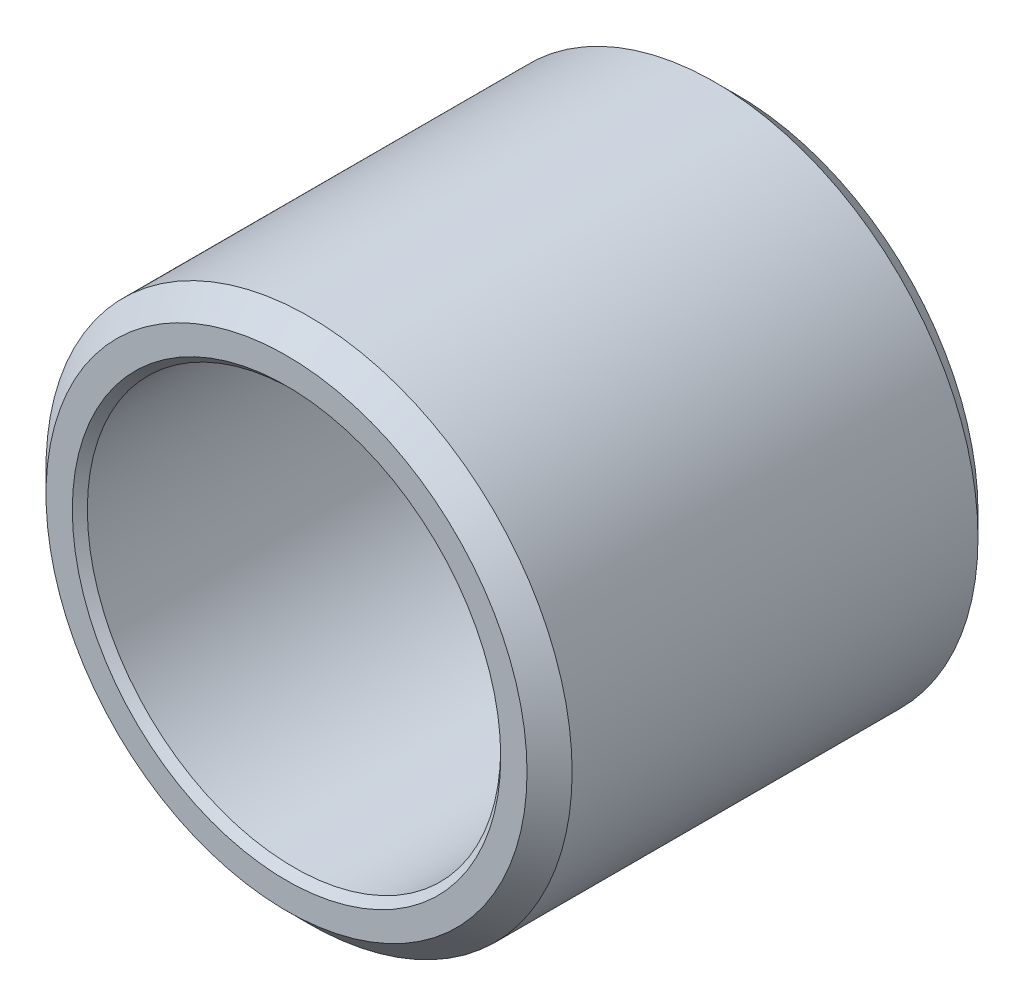
ISO-10303-21;
HEADER;
FILE_DESCRIPTION(('STEP AP214'),'2;1');
FILE_NAME('part.step','',(''),(''),'','','');
FILE_SCHEMA(('AUTOMOTIVE_DESIGN { 1 0 10303 214 1 1 1 1 }'));
ENDSEC;
DATA;
#1=APPLICATION_CONTEXT('core data for automotive mechanical design processes');
#2=APPLICATION_PROTOCOL_DEFINITION('international standard','automotive_design',2000,#1);
#3=PRODUCT_CONTEXT('',#1,'mechanical');
#4=PRODUCT('Part','Part','',(#3));
#5=PRODUCT_RELATED_PRODUCT_CATEGORY('part','',(#4));
#6=PRODUCT_DEFINITION_FORMATION('','',#4);
#7=PRODUCT_DEFINITION_CONTEXT('part definition',#1,'design');
#8=PRODUCT_DEFINITION('design','',#6,#7);
#9=PRODUCT_DEFINITION_SHAPE('','',#8);
#10=(LENGTH_UNIT() NAMED_UNIT(*) SI_UNIT(.MILLI.,.METRE.));
#11=(NAMED_UNIT(*) PLANE_ANGLE_UNIT() SI_UNIT($,.RADIAN.));
#12=(NAMED_UNIT(*) SI_UNIT($,.STERADIAN.) SOLID_ANGLE_UNIT());
#13=UNCERTAINTY_MEASURE_WITH_UNIT(LENGTH_MEASURE(1.E-05),#10,'distance_accuracy_value','');
#14=(GEOMETRIC_REPRESENTATION_CONTEXT(3) GLOBAL_UNCERTAINTY_ASSIGNED_CONTEXT((#13)) GLOBAL_UNIT_ASSIGNED_CONTEXT((#10,
#11,#12)) REPRESENTATION_CONTEXT('',''));
#15=CARTESIAN_POINT('',(0.,0.,0.));
#16=DIRECTION('',(0.,0.,1.));
#17=DIRECTION('',(1.,0.,0.));
#18=AXIS2_PLACEMENT_3D('',#15,#16,#17);
#19=CARTESIAN_POINT('',(0.,0.,60.));
#20=DIRECTION('',(0.,0.,-1.));
#21=DIRECTION('',(-1.,0.,0.));
#22=AXIS2_PLACEMENT_3D('',#19,#20,#21);
#23=CYLINDRICAL_SURFACE('',#22,27.5);
#24=CARTESIAN_POINT('',(0.,0.,59.));
#25=DIRECTION('',(0.,0.,1.));
#26=DIRECTION('',(1.,0.,0.));
#27=AXIS2_PLACEMENT_3D('',#24,#25,#26);
#28=CIRCLE('',#27,27.5);
#29=CARTESIAN_POINT('',(27.5,0.,59.));
#30=VERTEX_POINT('',#29);
#31=EDGE_CURVE('E39',#30,#30,#28,.T.);
#32=ORIENTED_EDGE('',*,*,#31,.T.);
#33=EDGE_LOOP('',(#32));
#34=FACE_BOUND('',#33,.T.);
#35=CARTESIAN_POINT('',(-8.88178419700125E-13,-4.9960036108132E-13,6.70000000000004));
#36=DIRECTION('',(0.,0.,-1.));
#37=DIRECTION('',(-1.,0.,0.));
#38=AXIS2_PLACEMENT_3D('',#35,#36,#37);
#39=CIRCLE('',#38,27.5);
#40=CARTESIAN_POINT('',(-27.5000000000009,-5.400541125411E-13,6.70000000000003));
#41=VERTEX_POINT('',#40);
#42=EDGE_CURVE('E53',#41,#41,#39,.T.);
#43=ORIENTED_EDGE('',*,*,#42,.T.);
#44=EDGE_LOOP('',(#43));
#45=FACE_BOUND('',#44,.T.);
#46=ADVANCED_FACE('F32',(#34,#45),#23,.F.);
#47=CARTESIAN_POINT('',(0.,0.,1.));
#48=DIRECTION('',(0.,0.,1.));
#49=DIRECTION('',(1.,0.,0.));
#50=AXIS2_PLACEMENT_3D('',#47,#48,#49);
#51=CIRCLE('',#50,27.5);
#52=CARTESIAN_POINT('',(27.5,0.,1.00000000000002));
#53=VERTEX_POINT('',#52);
#54=EDGE_CURVE('E43',#53,#53,#51,.F.);
#55=ORIENTED_EDGE('',*,*,#54,.T.);
#56=EDGE_LOOP('',(#55));
#57=FACE_BOUND('',#56,.T.);
#58=CARTESIAN_POINT('',(-8.88178419700125E-13,-4.9960036108132E-13,4.49999999999995));
#59=DIRECTION('',(0.,0.,1.));
#60=DIRECTION('',(1.,0.,0.));
#61=AXIS2_PLACEMENT_3D('',#58,#59,#60);
#62=CIRCLE('',#61,27.5);
#63=CARTESIAN_POINT('',(27.4999999999991,-4.59146609621541E-13,4.49999999999996));
#64=VERTEX_POINT('',#63);
#65=EDGE_CURVE('E57',#64,#64,#62,.T.);
#66=ORIENTED_EDGE('',*,*,#65,.T.);
#67=EDGE_LOOP('',(#66));
#68=FACE_BOUND('',#67,.T.);
#69=ADVANCED_FACE('F94',(#57,#68),#23,.F.);
#70=CARTESIAN_POINT('',(0.,0.,60.));
#71=DIRECTION('',(0.,0.,1.));
#72=DIRECTION('',(1.,0.,0.));
#73=AXIS2_PLACEMENT_3D('',#70,#71,#72);
#74=PLANE('',#73);
#75=CARTESIAN_POINT('',(0.,0.,60.));
#76=DIRECTION('',(0.,0.,1.));
#77=DIRECTION('',(1.,0.,0.));
#78=AXIS2_PLACEMENT_3D('',#75,#76,#77);
#79=CIRCLE('',#78,28.5);
#80=CARTESIAN_POINT('',(28.5,0.,60.));
#81=VERTEX_POINT('',#80);
#82=EDGE_CURVE('E10',#81,#81,#79,.F.);
#83=ORIENTED_EDGE('',*,*,#82,.T.);
#84=EDGE_LOOP('',(#83));
#85=FACE_BOUND('',#84,.T.);
#86=CARTESIAN_POINT('',(0.,0.,60.));
#87=DIRECTION('',(0.,0.,1.));
#88=DIRECTION('',(1.,0.,0.));
#89=AXIS2_PLACEMENT_3D('',#86,#87,#88);
#90=CIRCLE('',#89,32.);
#91=CARTESIAN_POINT('',(32.,0.,60.));
#92=VERTEX_POINT('',#91);
#93=EDGE_CURVE('E52',#92,#92,#90,.T.);
#94=ORIENTED_EDGE('',*,*,#93,.T.);
#95=EDGE_LOOP('',(#94));
#96=FACE_BOUND('',#95,.T.);
#97=ADVANCED_FACE('F99',(#85,#96),#74,.T.);
#98=CARTESIAN_POINT('',(0.,0.,0.));
#99=DIRECTION('',(0.,0.,1.));
#100=DIRECTION('',(1.,0.,0.));
#101=AXIS2_PLACEMENT_3D('',#98,#99,#100);
#102=PLANE('',#101);
#103=CARTESIAN_POINT('',(0.,0.,0.));
#104=DIRECTION('',(0.,0.,1.));
#105=DIRECTION('',(1.,0.,0.));
#106=AXIS2_PLACEMENT_3D('',#103,#104,#105);
#107=CIRCLE('',#106,28.5);
#108=CARTESIAN_POINT('',(28.5,0.,0.));
#109=VERTEX_POINT('',#108);
#110=EDGE_CURVE('E47',#109,#109,#107,.T.);
#111=ORIENTED_EDGE('',*,*,#110,.T.);
#112=EDGE_LOOP('',(#111));
#113=FACE_BOUND('',#112,.T.);
#114=CARTESIAN_POINT('',(0.,0.,0.));
#115=DIRECTION('',(0.,0.,1.));
#116=DIRECTION('',(1.,0.,0.));
#117=AXIS2_PLACEMENT_3D('',#114,#115,#116);
#118=CIRCLE('',#117,32.);
#119=CARTESIAN_POINT('',(32.,0.,0.));
#120=VERTEX_POINT('',#119);
#121=EDGE_CURVE('E63',#120,#120,#118,.F.);
#122=ORIENTED_EDGE('',*,*,#121,.T.);
#123=EDGE_LOOP('',(#122));
#124=FACE_BOUND('',#123,.T.);
#125=ADVANCED_FACE('F106',(#113,#124),#102,.F.);
#126=CARTESIAN_POINT('',(0.,0.,60.));
#127=DIRECTION('',(0.,0.,-1.));
#128=DIRECTION('',(-1.,0.,0.));
#129=AXIS2_PLACEMENT_3D('',#126,#127,#128);
#130=CYLINDRICAL_SURFACE('',#129,35.);
#131=CARTESIAN_POINT('',(-2.22044604925031E-13,-6.10622663543836E-13,3.));
#132=DIRECTION('',(0.,0.,1.));
#133=DIRECTION('',(1.,0.,0.));
#134=AXIS2_PLACEMENT_3D('',#131,#132,#133);
#135=CIRCLE('',#134,35.);
#136=CARTESIAN_POINT('',(34.9999999999998,-5.59136070776844E-13,3.00000000000002));
#137=VERTEX_POINT('',#136);
#138=EDGE_CURVE('E66',#137,#137,#135,.T.);
#139=ORIENTED_EDGE('',*,*,#138,.T.);
#140=EDGE_LOOP('',(#139));
#141=FACE_BOUND('',#140,.T.);
#142=CARTESIAN_POINT('',(6.66133814775094E-13,4.44089209850063E-13,57.0000000000001));
#143=DIRECTION('',(0.,0.,1.));
#144=DIRECTION('',(1.,0.,0.));
#145=AXIS2_PLACEMENT_3D('',#142,#143,#144);
#146=CIRCLE('',#145,35.);
#147=CARTESIAN_POINT('',(35.0000000000007,4.95575802617054E-13,57.0000000000001));
#148=VERTEX_POINT('',#147);
#149=EDGE_CURVE('E56',#148,#148,#146,.F.);
#150=ORIENTED_EDGE('',*,*,#149,.T.);
#151=EDGE_LOOP('',(#150));
#152=FACE_BOUND('',#151,.T.);
#153=ADVANCED_FACE('F109',(#141,#152),#130,.T.);
#154=CARTESIAN_POINT('',(-2.22044604925031E-13,-6.10622663543836E-13,3.));
#155=DIRECTION('',(0.,0.,1.));
#156=DIRECTION('',(1.,0.,0.));
#157=AXIS2_PLACEMENT_3D('',#154,#155,#156);
#158=CONICAL_SURFACE('',#157,35.,0.785398163397451);
#159=ORIENTED_EDGE('',*,*,#121,.F.);
#160=EDGE_LOOP('',(#159));
#161=FACE_BOUND('',#160,.T.);
#162=ORIENTED_EDGE('',*,*,#138,.F.);
#163=EDGE_LOOP('',(#162));
#164=FACE_BOUND('',#163,.T.);
#165=ADVANCED_FACE('F113',(#161,#164),#158,.T.);
#166=CARTESIAN_POINT('',(0.,0.,60.));
#167=DIRECTION('',(0.,0.,-1.));
#168=DIRECTION('',(-1.,0.,0.));
#169=AXIS2_PLACEMENT_3D('',#166,#167,#168);
#170=CONICAL_SURFACE('',#169,32.,0.785398163397446);
#171=ORIENTED_EDGE('',*,*,#149,.F.);
#172=EDGE_LOOP('',(#171));
#173=FACE_BOUND('',#172,.T.);
#174=ORIENTED_EDGE('',*,*,#93,.F.);
#175=EDGE_LOOP('',(#174));
#176=FACE_BOUND('',#175,.T.);
#177=ADVANCED_FACE('F117',(#173,#176),#170,.T.);
#178=CARTESIAN_POINT('',(-8.88178419700125E-13,-4.9960036108132E-13,6.70000000000004));
#179=DIRECTION('',(0.,0.,-1.));
#180=DIRECTION('',(-1.,0.,0.));
#181=AXIS2_PLACEMENT_3D('',#178,#179,#180);
#182=PLANE('',#181);
#183=ORIENTED_EDGE('',*,*,#42,.F.);
#184=EDGE_LOOP('',(#183));
#185=FACE_BOUND('',#184,.T.);
#186=CARTESIAN_POINT('',(-8.88178419700125E-13,-4.9960036108132E-13,6.70000000000004));
#187=DIRECTION('',(0.,0.,-1.));
#188=DIRECTION('',(-1.,0.,0.));
#189=AXIS2_PLACEMENT_3D('',#186,#187,#188);
#190=CIRCLE('',#189,29.);
#191=CARTESIAN_POINT('',(-29.0000000000009,-5.42260680802542E-13,6.70000000000002));
#192=VERTEX_POINT('',#191);
#193=EDGE_CURVE('E60',#192,#192,#190,.T.);
#194=ORIENTED_EDGE('',*,*,#193,.T.);
#195=EDGE_LOOP('',(#194));
#196=FACE_BOUND('',#195,.T.);
#197=ADVANCED_FACE('F90',(#185,#196),#182,.T.);
#198=CARTESIAN_POINT('',(0.,0.,0.));
#199=DIRECTION('',(0.,0.,-1.));
#200=DIRECTION('',(-1.,0.,0.));
#201=AXIS2_PLACEMENT_3D('',#198,#199,#200);
#202=CYLINDRICAL_SURFACE('',#201,29.);
#203=CARTESIAN_POINT('',(-8.88178419700125E-13,-4.9960036108132E-13,4.50000000000006));
#204=DIRECTION('',(0.,0.,-1.));
#205=DIRECTION('',(-1.,0.,0.));
#206=AXIS2_PLACEMENT_3D('',#203,#204,#205);
#207=CIRCLE('',#206,29.);
#208=CARTESIAN_POINT('',(-29.0000000000009,-5.42260680802542E-13,4.50000000000004));
#209=VERTEX_POINT('',#208);
#210=EDGE_CURVE('E73',#209,#209,#207,.T.);
#211=ORIENTED_EDGE('',*,*,#210,.T.);
#212=EDGE_LOOP('',(#211));
#213=FACE_BOUND('',#212,.T.);
#214=ORIENTED_EDGE('',*,*,#193,.F.);
#215=EDGE_LOOP('',(#214));
#216=FACE_BOUND('',#215,.T.);
#217=ADVANCED_FACE('F77',(#213,#216),#202,.F.);
#218=CARTESIAN_POINT('',(-8.88178419700125E-13,-4.9960036108132E-13,4.50000000000006));
#219=DIRECTION('',(0.,0.,1.));
#220=DIRECTION('',(1.,0.,0.));
#221=AXIS2_PLACEMENT_3D('',#218,#219,#220);
#222=PLANE('',#221);
#223=ORIENTED_EDGE('',*,*,#65,.F.);
#224=EDGE_LOOP('',(#223));
#225=FACE_BOUND('',#224,.T.);
#226=ORIENTED_EDGE('',*,*,#210,.F.);
#227=EDGE_LOOP('',(#226));
#228=FACE_BOUND('',#227,.T.);
#229=ADVANCED_FACE('F80',(#225,#228),#222,.T.);
#230=CARTESIAN_POINT('',(0.,0.,0.));
#231=DIRECTION('',(0.,0.,-1.));
#232=DIRECTION('',(-1.,0.,0.));
#233=AXIS2_PLACEMENT_3D('',#230,#231,#232);
#234=CONICAL_SURFACE('',#233,28.5,0.785398163397443);
#235=ORIENTED_EDGE('',*,*,#54,.F.);
#236=EDGE_LOOP('',(#235));
#237=FACE_BOUND('',#236,.T.);
#238=ORIENTED_EDGE('',*,*,#110,.F.);
#239=EDGE_LOOP('',(#238));
#240=FACE_BOUND('',#239,.T.);
#241=ADVANCED_FACE('F82',(#237,#240),#234,.F.);
#242=CARTESIAN_POINT('',(0.,0.,59.));
#243=DIRECTION('',(0.,0.,1.));
#244=DIRECTION('',(1.,0.,0.));
#245=AXIS2_PLACEMENT_3D('',#242,#243,#244);
#246=CONICAL_SURFACE('',#245,27.5,0.785398163397459);
#247=ORIENTED_EDGE('',*,*,#82,.F.);
#248=EDGE_LOOP('',(#247));
#249=FACE_BOUND('',#248,.T.);
#250=ORIENTED_EDGE('',*,*,#31,.F.);
#251=EDGE_LOOP('',(#250));
#252=FACE_BOUND('',#251,.T.);
#253=ADVANCED_FACE('F34',(#249,#252),#246,.F.);
#254=CLOSED_SHELL('',(#46,#69,#97,#125,#153,#165,#177,#197,#217,#229,#241,#253));
#255=MANIFOLD_SOLID_BREP('B2',#254);
#256=ADVANCED_BREP_SHAPE_REPRESENTATION('',(#18,#255),#14);
#257=SHAPE_DEFINITION_REPRESENTATION(#9,#256);
ENDSEC;
END-ISO-10303-21;
